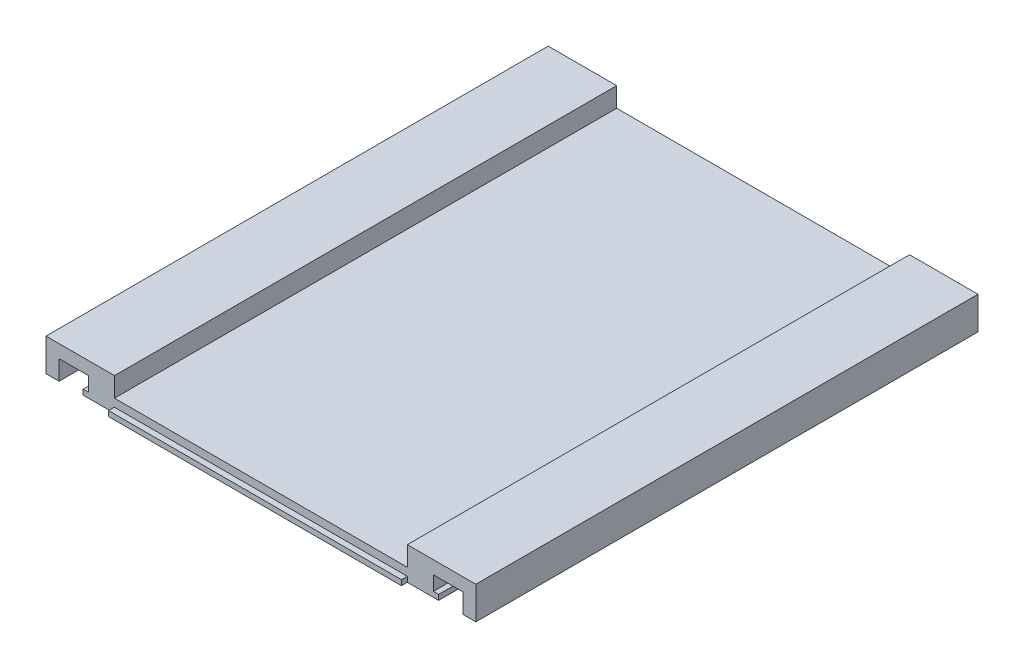
ISO-10303-21;
HEADER;
FILE_DESCRIPTION(('STEP AP214'),'2;1');
FILE_NAME('part.step','',(''),(''),'','','');
FILE_SCHEMA(('AUTOMOTIVE_DESIGN { 1 0 10303 214 1 1 1 1 }'));
ENDSEC;
DATA;
#1=APPLICATION_CONTEXT('core data for automotive mechanical design processes');
#2=APPLICATION_PROTOCOL_DEFINITION('international standard','automotive_design',2000,#1);
#3=PRODUCT_CONTEXT('',#1,'mechanical');
#4=PRODUCT('Part','Part','',(#3));
#5=PRODUCT_RELATED_PRODUCT_CATEGORY('part','',(#4));
#6=PRODUCT_DEFINITION_FORMATION('','',#4);
#7=PRODUCT_DEFINITION_CONTEXT('part definition',#1,'design');
#8=PRODUCT_DEFINITION('design','',#6,#7);
#9=PRODUCT_DEFINITION_SHAPE('','',#8);
#10=(LENGTH_UNIT() NAMED_UNIT(*) SI_UNIT(.MILLI.,.METRE.));
#11=(NAMED_UNIT(*) PLANE_ANGLE_UNIT() SI_UNIT($,.RADIAN.));
#12=(NAMED_UNIT(*) SI_UNIT($,.STERADIAN.) SOLID_ANGLE_UNIT());
#13=UNCERTAINTY_MEASURE_WITH_UNIT(LENGTH_MEASURE(1.E-05),#10,'distance_accuracy_value','');
#14=(GEOMETRIC_REPRESENTATION_CONTEXT(3) GLOBAL_UNCERTAINTY_ASSIGNED_CONTEXT((#13)) GLOBAL_UNIT_ASSIGNED_CONTEXT((#10,
#11,#12)) REPRESENTATION_CONTEXT('',''));
#15=CARTESIAN_POINT('',(0.,0.,0.));
#16=DIRECTION('',(0.,0.,1.));
#17=DIRECTION('',(1.,0.,0.));
#18=AXIS2_PLACEMENT_3D('',#15,#16,#17);
#19=CARTESIAN_POINT('',(0.,2.,0.));
#20=DIRECTION('',(0.,1.,0.));
#21=DIRECTION('',(0.,0.,1.));
#22=AXIS2_PLACEMENT_3D('',#19,#20,#21);
#23=PLANE('',#22);
#24=DIRECTION('',(-1.,0.,0.));
#25=VECTOR('',#24,1.);
#26=CARTESIAN_POINT('',(0.,2.,38.5));
#27=LINE('',#26,#25);
#28=CARTESIAN_POINT('',(22.45,2.,38.5));
#29=VERTEX_POINT('',#28);
#30=CARTESIAN_POINT('',(-22.45,2.,38.5));
#31=VERTEX_POINT('',#30);
#32=EDGE_CURVE('E68',#29,#31,#27,.T.);
#33=ORIENTED_EDGE('',*,*,#32,.F.);
#34=DIRECTION('',(0.,0.,-1.));
#35=VECTOR('',#34,1.);
#36=CARTESIAN_POINT('',(22.45,2.,50.129703349613));
#37=LINE('',#36,#35);
#38=CARTESIAN_POINT('',(22.45,2.,-38.5));
#39=VERTEX_POINT('',#38);
#40=EDGE_CURVE('E221',#29,#39,#37,.T.);
#41=ORIENTED_EDGE('',*,*,#40,.T.);
#42=DIRECTION('',(-1.,0.,0.));
#43=VECTOR('',#42,1.);
#44=CARTESIAN_POINT('',(0.,2.,-38.5));
#45=LINE('',#44,#43);
#46=CARTESIAN_POINT('',(-22.45,2.,-38.5));
#47=VERTEX_POINT('',#46);
#48=EDGE_CURVE('E209',#39,#47,#45,.T.);
#49=ORIENTED_EDGE('',*,*,#48,.T.);
#50=DIRECTION('',(0.,0.,-1.));
#51=VECTOR('',#50,1.);
#52=CARTESIAN_POINT('',(-22.45,2.,50.129703349613));
#53=LINE('',#52,#51);
#54=EDGE_CURVE('E64',#31,#47,#53,.T.);
#55=ORIENTED_EDGE('',*,*,#54,.F.);
#56=EDGE_LOOP('',(#33,#41,#49,#55));
#57=FACE_BOUND('',#56,.T.);
#58=ADVANCED_FACE('F47',(#57),#23,.T.);
#59=CARTESIAN_POINT('',(0.,0.,0.));
#60=DIRECTION('',(0.,1.,0.));
#61=DIRECTION('',(0.,0.,1.));
#62=AXIS2_PLACEMENT_3D('',#59,#60,#61);
#63=PLANE('',#62);
#64=DIRECTION('',(0.,0.,-1.));
#65=VECTOR('',#64,1.);
#66=CARTESIAN_POINT('',(-22.45,0.,38.5));
#67=LINE('',#66,#65);
#68=CARTESIAN_POINT('',(-22.45,0.,39.4));
#69=VERTEX_POINT('',#68);
#70=CARTESIAN_POINT('',(-22.45,0.,38.5));
#71=VERTEX_POINT('',#70);
#72=EDGE_CURVE('E354',#69,#71,#67,.T.);
#73=ORIENTED_EDGE('',*,*,#72,.T.);
#74=DIRECTION('',(-1.,0.,0.));
#75=VECTOR('',#74,1.);
#76=CARTESIAN_POINT('',(-27.25,0.,38.5));
#77=LINE('',#76,#75);
#78=CARTESIAN_POINT('',(-27.25,0.,38.5));
#79=VERTEX_POINT('',#78);
#80=EDGE_CURVE('E350',#71,#79,#77,.T.);
#81=ORIENTED_EDGE('',*,*,#80,.T.);
#82=DIRECTION('',(0.,0.,1.));
#83=VECTOR('',#82,1.);
#84=CARTESIAN_POINT('',(-27.25,0.,0.));
#85=LINE('',#84,#83);
#86=CARTESIAN_POINT('',(-27.25,0.,-38.5));
#87=VERTEX_POINT('',#86);
#88=EDGE_CURVE('E398',#87,#79,#85,.T.);
#89=ORIENTED_EDGE('',*,*,#88,.F.);
#90=DIRECTION('',(-1.,0.,0.));
#91=VECTOR('',#90,1.);
#92=CARTESIAN_POINT('',(0.,0.,-38.5));
#93=LINE('',#92,#91);
#94=CARTESIAN_POINT('',(27.25,0.,-38.5));
#95=VERTEX_POINT('',#94);
#96=EDGE_CURVE('E219',#95,#87,#93,.T.);
#97=ORIENTED_EDGE('',*,*,#96,.F.);
#98=DIRECTION('',(0.,0.,1.));
#99=VECTOR('',#98,1.);
#100=CARTESIAN_POINT('',(27.25,0.,0.));
#101=LINE('',#100,#99);
#102=CARTESIAN_POINT('',(27.25,0.,38.5));
#103=VERTEX_POINT('',#102);
#104=EDGE_CURVE('E407',#95,#103,#101,.T.);
#105=ORIENTED_EDGE('',*,*,#104,.T.);
#106=DIRECTION('',(-1.,0.,0.));
#107=VECTOR('',#106,1.);
#108=CARTESIAN_POINT('',(27.25,0.,38.5));
#109=LINE('',#108,#107);
#110=CARTESIAN_POINT('',(22.45,0.,38.5));
#111=VERTEX_POINT('',#110);
#112=EDGE_CURVE('E358',#103,#111,#109,.T.);
#113=ORIENTED_EDGE('',*,*,#112,.T.);
#114=DIRECTION('',(0.,0.,1.));
#115=VECTOR('',#114,1.);
#116=CARTESIAN_POINT('',(22.45,0.,38.5));
#117=LINE('',#116,#115);
#118=CARTESIAN_POINT('',(22.45,0.,39.4));
#119=VERTEX_POINT('',#118);
#120=EDGE_CURVE('E382',#111,#119,#117,.T.);
#121=ORIENTED_EDGE('',*,*,#120,.T.);
#122=DIRECTION('',(1.,0.,0.));
#123=VECTOR('',#122,1.);
#124=CARTESIAN_POINT('',(-27.25,0.,39.4));
#125=LINE('',#124,#123);
#126=EDGE_CURVE('E371',#69,#119,#125,.T.);
#127=ORIENTED_EDGE('',*,*,#126,.F.);
#128=EDGE_LOOP('',(#73,#81,#89,#97,#105,#113,#121,#127));
#129=FACE_BOUND('',#128,.T.);
#130=ADVANCED_FACE('F474',(#129),#63,.F.);
#131=CARTESIAN_POINT('',(-27.25,0.8,0.));
#132=DIRECTION('',(1.,0.,0.));
#133=DIRECTION('',(0.,0.,-1.));
#134=AXIS2_PLACEMENT_3D('',#131,#132,#133);
#135=PLANE('',#134);
#136=DIRECTION('',(0.,-1.,0.));
#137=VECTOR('',#136,1.);
#138=CARTESIAN_POINT('',(-27.25,0.8,38.5));
#139=LINE('',#138,#137);
#140=CARTESIAN_POINT('',(-27.25,0.8,38.5));
#141=VERTEX_POINT('',#140);
#142=EDGE_CURVE('E353',#141,#79,#139,.T.);
#143=ORIENTED_EDGE('',*,*,#142,.F.);
#144=DIRECTION('',(0.,0.,1.));
#145=VECTOR('',#144,1.);
#146=CARTESIAN_POINT('',(-27.25,0.8,0.));
#147=LINE('',#146,#145);
#148=CARTESIAN_POINT('',(-27.25,0.8,-38.5));
#149=VERTEX_POINT('',#148);
#150=EDGE_CURVE('E427',#149,#141,#147,.T.);
#151=ORIENTED_EDGE('',*,*,#150,.F.);
#152=DIRECTION('',(0.,-1.,0.));
#153=VECTOR('',#152,1.);
#154=CARTESIAN_POINT('',(-27.25,0.8,-38.5));
#155=LINE('',#154,#153);
#156=EDGE_CURVE('E419',#149,#87,#155,.T.);
#157=ORIENTED_EDGE('',*,*,#156,.T.);
#158=ORIENTED_EDGE('',*,*,#88,.T.);
#159=EDGE_LOOP('',(#143,#151,#157,#158));
#160=FACE_BOUND('',#159,.T.);
#161=ADVANCED_FACE('F478',(#160),#135,.F.);
#162=CARTESIAN_POINT('',(27.25,0.8,0.));
#163=DIRECTION('',(1.,0.,0.));
#164=DIRECTION('',(0.,0.,-1.));
#165=AXIS2_PLACEMENT_3D('',#162,#163,#164);
#166=PLANE('',#165);
#167=DIRECTION('',(0.,0.,1.));
#168=VECTOR('',#167,1.);
#169=CARTESIAN_POINT('',(27.25,0.8,0.));
#170=LINE('',#169,#168);
#171=CARTESIAN_POINT('',(27.25,0.8,-38.5));
#172=VERTEX_POINT('',#171);
#173=CARTESIAN_POINT('',(27.25,0.8,38.5));
#174=VERTEX_POINT('',#173);
#175=EDGE_CURVE('E411',#172,#174,#170,.T.);
#176=ORIENTED_EDGE('',*,*,#175,.T.);
#177=DIRECTION('',(0.,-1.,0.));
#178=VECTOR('',#177,1.);
#179=CARTESIAN_POINT('',(27.25,0.8,38.5));
#180=LINE('',#179,#178);
#181=EDGE_CURVE('E242',#174,#103,#180,.T.);
#182=ORIENTED_EDGE('',*,*,#181,.T.);
#183=ORIENTED_EDGE('',*,*,#104,.F.);
#184=DIRECTION('',(0.,-1.,0.));
#185=VECTOR('',#184,1.);
#186=CARTESIAN_POINT('',(27.25,0.8,-38.5));
#187=LINE('',#186,#185);
#188=EDGE_CURVE('E415',#172,#95,#187,.T.);
#189=ORIENTED_EDGE('',*,*,#188,.F.);
#190=EDGE_LOOP('',(#176,#182,#183,#189));
#191=FACE_BOUND('',#190,.T.);
#192=ADVANCED_FACE('F469',(#191),#166,.T.);
#193=CARTESIAN_POINT('',(0.,0.8,0.));
#194=DIRECTION('',(0.,1.,0.));
#195=DIRECTION('',(0.,0.,1.));
#196=AXIS2_PLACEMENT_3D('',#193,#194,#195);
#197=PLANE('',#196);
#198=DIRECTION('',(-1.,0.,0.));
#199=VECTOR('',#198,1.);
#200=CARTESIAN_POINT('',(27.25,0.8,38.5));
#201=LINE('',#200,#199);
#202=CARTESIAN_POINT('',(22.45,0.8,38.5));
#203=VERTEX_POINT('',#202);
#204=CARTESIAN_POINT('',(-22.45,0.8,38.5));
#205=VERTEX_POINT('',#204);
#206=EDGE_CURVE('E11',#203,#205,#201,.T.);
#207=ORIENTED_EDGE('',*,*,#206,.T.);
#208=DIRECTION('',(0.,0.,-1.));
#209=VECTOR('',#208,1.);
#210=CARTESIAN_POINT('',(-22.45,0.8,38.5));
#211=LINE('',#210,#209);
#212=CARTESIAN_POINT('',(-22.45,0.8,39.4));
#213=VERTEX_POINT('',#212);
#214=EDGE_CURVE('E346',#213,#205,#211,.T.);
#215=ORIENTED_EDGE('',*,*,#214,.F.);
#216=DIRECTION('',(1.,0.,0.));
#217=VECTOR('',#216,1.);
#218=CARTESIAN_POINT('',(-27.25,0.8,39.4));
#219=LINE('',#218,#217);
#220=CARTESIAN_POINT('',(22.45,0.8,39.4));
#221=VERTEX_POINT('',#220);
#222=EDGE_CURVE('E394',#213,#221,#219,.T.);
#223=ORIENTED_EDGE('',*,*,#222,.T.);
#224=DIRECTION('',(0.,0.,1.));
#225=VECTOR('',#224,1.);
#226=CARTESIAN_POINT('',(22.45,0.8,38.5));
#227=LINE('',#226,#225);
#228=EDGE_CURVE('E381',#203,#221,#227,.T.);
#229=ORIENTED_EDGE('',*,*,#228,.F.);
#230=EDGE_LOOP('',(#207,#215,#223,#229));
#231=FACE_BOUND('',#230,.T.);
#232=ADVANCED_FACE('F548',(#231),#197,.T.);
#233=ORIENTED_EDGE('',*,*,#150,.T.);
#234=DIRECTION('',(-1.,0.,0.));
#235=VECTOR('',#234,1.);
#236=CARTESIAN_POINT('',(-27.25,0.8,38.5));
#237=LINE('',#236,#235);
#238=CARTESIAN_POINT('',(-26.45,0.8,38.5));
#239=VERTEX_POINT('',#238);
#240=EDGE_CURVE('E349',#239,#141,#237,.T.);
#241=ORIENTED_EDGE('',*,*,#240,.F.);
#242=DIRECTION('',(0.,0.,1.));
#243=VECTOR('',#242,1.);
#244=CARTESIAN_POINT('',(-26.45,0.8,0.));
#245=LINE('',#244,#243);
#246=CARTESIAN_POINT('',(-26.45,0.8,-38.5));
#247=VERTEX_POINT('',#246);
#248=EDGE_CURVE('E431',#247,#239,#245,.T.);
#249=ORIENTED_EDGE('',*,*,#248,.F.);
#250=DIRECTION('',(-1.,0.,0.));
#251=VECTOR('',#250,1.);
#252=CARTESIAN_POINT('',(0.,0.8,-38.5));
#253=LINE('',#252,#251);
#254=EDGE_CURVE('E423',#247,#149,#253,.T.);
#255=ORIENTED_EDGE('',*,*,#254,.T.);
#256=EDGE_LOOP('',(#233,#241,#249,#255));
#257=FACE_BOUND('',#256,.T.);
#258=ADVANCED_FACE('F481',(#257),#197,.T.);
#259=DIRECTION('',(0.,0.,1.));
#260=VECTOR('',#259,1.);
#261=CARTESIAN_POINT('',(26.45,0.8,0.));
#262=LINE('',#261,#260);
#263=CARTESIAN_POINT('',(26.45,0.8,-38.5));
#264=VERTEX_POINT('',#263);
#265=CARTESIAN_POINT('',(26.45,0.8,38.5));
#266=VERTEX_POINT('',#265);
#267=EDGE_CURVE('E406',#264,#266,#262,.T.);
#268=ORIENTED_EDGE('',*,*,#267,.T.);
#269=DIRECTION('',(-1.,0.,0.));
#270=VECTOR('',#269,1.);
#271=CARTESIAN_POINT('',(27.25,0.8,38.5));
#272=LINE('',#271,#270);
#273=EDGE_CURVE('E386',#174,#266,#272,.T.);
#274=ORIENTED_EDGE('',*,*,#273,.F.);
#275=ORIENTED_EDGE('',*,*,#175,.F.);
#276=DIRECTION('',(-1.,0.,0.));
#277=VECTOR('',#276,1.);
#278=CARTESIAN_POINT('',(0.,0.8,-38.5));
#279=LINE('',#278,#277);
#280=EDGE_CURVE('E402',#172,#264,#279,.T.);
#281=ORIENTED_EDGE('',*,*,#280,.T.);
#282=EDGE_LOOP('',(#268,#274,#275,#281));
#283=FACE_BOUND('',#282,.T.);
#284=ADVANCED_FACE('F466',(#283),#197,.T.);
#285=CARTESIAN_POINT('',(-27.25,0.8,39.4));
#286=DIRECTION('',(0.,0.,-1.));
#287=DIRECTION('',(-1.,0.,0.));
#288=AXIS2_PLACEMENT_3D('',#285,#286,#287);
#289=PLANE('',#288);
#290=DIRECTION('',(0.,-1.,0.));
#291=VECTOR('',#290,1.);
#292=CARTESIAN_POINT('',(-22.45,0.8,39.4));
#293=LINE('',#292,#291);
#294=EDGE_CURVE('E367',#213,#69,#293,.T.);
#295=ORIENTED_EDGE('',*,*,#294,.T.);
#296=ORIENTED_EDGE('',*,*,#126,.T.);
#297=DIRECTION('',(0.,-1.,0.));
#298=VECTOR('',#297,1.);
#299=CARTESIAN_POINT('',(22.45,0.8,39.4));
#300=LINE('',#299,#298);
#301=EDGE_CURVE('E378',#221,#119,#300,.T.);
#302=ORIENTED_EDGE('',*,*,#301,.F.);
#303=ORIENTED_EDGE('',*,*,#222,.F.);
#304=EDGE_LOOP('',(#295,#296,#302,#303));
#305=FACE_BOUND('',#304,.T.);
#306=ADVANCED_FACE('F541',(#305),#289,.F.);
#307=CARTESIAN_POINT('',(26.45,2.,0.));
#308=DIRECTION('',(1.,0.,0.));
#309=DIRECTION('',(0.,0.,-1.));
#310=AXIS2_PLACEMENT_3D('',#307,#308,#309);
#311=PLANE('',#310);
#312=ORIENTED_EDGE('',*,*,#267,.F.);
#313=DIRECTION('',(0.,-1.,0.));
#314=VECTOR('',#313,1.);
#315=CARTESIAN_POINT('',(26.45,2.,-38.5));
#316=LINE('',#315,#314);
#317=CARTESIAN_POINT('',(26.45,3.,-38.5));
#318=VERTEX_POINT('',#317);
#319=EDGE_CURVE('E51',#318,#264,#316,.T.);
#320=ORIENTED_EDGE('',*,*,#319,.F.);
#321=DIRECTION('',(0.,0.,-1.));
#322=VECTOR('',#321,1.);
#323=CARTESIAN_POINT('',(26.45,3.,50.129703349613));
#324=LINE('',#323,#322);
#325=CARTESIAN_POINT('',(26.45,3.,38.5));
#326=VERTEX_POINT('',#325);
#327=EDGE_CURVE('E226',#326,#318,#324,.T.);
#328=ORIENTED_EDGE('',*,*,#327,.F.);
#329=DIRECTION('',(0.,-1.,0.));
#330=VECTOR('',#329,1.);
#331=CARTESIAN_POINT('',(26.45,2.,38.5));
#332=LINE('',#331,#330);
#333=EDGE_CURVE('E443',#326,#266,#332,.T.);
#334=ORIENTED_EDGE('',*,*,#333,.T.);
#335=EDGE_LOOP('',(#312,#320,#328,#334));
#336=FACE_BOUND('',#335,.T.);
#337=ADVANCED_FACE('F49',(#336),#311,.T.);
#338=CARTESIAN_POINT('',(0.,2.,-38.5));
#339=DIRECTION('',(0.,0.,1.));
#340=DIRECTION('',(1.,0.,0.));
#341=AXIS2_PLACEMENT_3D('',#338,#339,#340);
#342=PLANE('',#341);
#343=ORIENTED_EDGE('',*,*,#96,.T.);
#344=ORIENTED_EDGE('',*,*,#156,.F.);
#345=ORIENTED_EDGE('',*,*,#254,.F.);
#346=DIRECTION('',(0.,-1.,0.));
#347=VECTOR('',#346,1.);
#348=CARTESIAN_POINT('',(-26.45,2.,-38.5));
#349=LINE('',#348,#347);
#350=CARTESIAN_POINT('',(-26.45,3.,-38.5));
#351=VERTEX_POINT('',#350);
#352=EDGE_CURVE('E452',#351,#247,#349,.T.);
#353=ORIENTED_EDGE('',*,*,#352,.F.);
#354=DIRECTION('',(-1.,0.,0.));
#355=VECTOR('',#354,1.);
#356=CARTESIAN_POINT('',(-30.95,2.99999999999999,-38.5));
#357=LINE('',#356,#355);
#358=CARTESIAN_POINT('',(-30.95,2.99999999999999,-38.5));
#359=VERTEX_POINT('',#358);
#360=EDGE_CURVE('E341',#351,#359,#357,.T.);
#361=ORIENTED_EDGE('',*,*,#360,.T.);
#362=DIRECTION('',(0.,-1.,0.));
#363=VECTOR('',#362,1.);
#364=CARTESIAN_POINT('',(-30.95,0.,-38.5));
#365=LINE('',#364,#363);
#366=CARTESIAN_POINT('',(-30.95,0.,-38.5));
#367=VERTEX_POINT('',#366);
#368=EDGE_CURVE('E282',#359,#367,#365,.T.);
#369=ORIENTED_EDGE('',*,*,#368,.T.);
#370=DIRECTION('',(-1.,0.,0.));
#371=VECTOR('',#370,1.);
#372=CARTESIAN_POINT('',(-32.95,0.,-38.5));
#373=LINE('',#372,#371);
#374=CARTESIAN_POINT('',(-32.95,0.,-38.5));
#375=VERTEX_POINT('',#374);
#376=EDGE_CURVE('E328',#367,#375,#373,.T.);
#377=ORIENTED_EDGE('',*,*,#376,.T.);
#378=DIRECTION('',(0.,1.,0.));
#379=VECTOR('',#378,1.);
#380=CARTESIAN_POINT('',(-32.95,4.99999999999999,-38.5));
#381=LINE('',#380,#379);
#382=CARTESIAN_POINT('',(-32.95,4.99999999999999,-38.5));
#383=VERTEX_POINT('',#382);
#384=EDGE_CURVE('E332',#375,#383,#381,.T.);
#385=ORIENTED_EDGE('',*,*,#384,.T.);
#386=DIRECTION('',(1.,0.,0.));
#387=VECTOR('',#386,1.);
#388=CARTESIAN_POINT('',(-22.45,4.99999999999999,-38.5));
#389=LINE('',#388,#387);
#390=CARTESIAN_POINT('',(-22.45,4.99999999999999,-38.5));
#391=VERTEX_POINT('',#390);
#392=EDGE_CURVE('E336',#383,#391,#389,.T.);
#393=ORIENTED_EDGE('',*,*,#392,.T.);
#394=DIRECTION('',(0.,-1.,0.));
#395=VECTOR('',#394,1.);
#396=CARTESIAN_POINT('',(-22.45,2.99999999999999,-38.5));
#397=LINE('',#396,#395);
#398=EDGE_CURVE('E217',#391,#47,#397,.T.);
#399=ORIENTED_EDGE('',*,*,#398,.T.);
#400=ORIENTED_EDGE('',*,*,#48,.F.);
#401=DIRECTION('',(0.,1.,0.));
#402=VECTOR('',#401,1.);
#403=CARTESIAN_POINT('',(22.45,3.,-38.5));
#404=LINE('',#403,#402);
#405=CARTESIAN_POINT('',(22.45,5.,-38.5));
#406=VERTEX_POINT('',#405);
#407=EDGE_CURVE('E213',#39,#406,#404,.T.);
#408=ORIENTED_EDGE('',*,*,#407,.T.);
#409=DIRECTION('',(1.,0.,0.));
#410=VECTOR('',#409,1.);
#411=CARTESIAN_POINT('',(22.45,5.,-38.5));
#412=LINE('',#411,#410);
#413=CARTESIAN_POINT('',(32.95,5.,-38.5));
#414=VERTEX_POINT('',#413);
#415=EDGE_CURVE('E231',#406,#414,#412,.T.);
#416=ORIENTED_EDGE('',*,*,#415,.T.);
#417=DIRECTION('',(0.,-1.,0.));
#418=VECTOR('',#417,1.);
#419=CARTESIAN_POINT('',(32.95,5.,-38.5));
#420=LINE('',#419,#418);
#421=CARTESIAN_POINT('',(32.95,0.,-38.5));
#422=VERTEX_POINT('',#421);
#423=EDGE_CURVE('E234',#414,#422,#420,.T.);
#424=ORIENTED_EDGE('',*,*,#423,.T.);
#425=DIRECTION('',(-1.,0.,0.));
#426=VECTOR('',#425,1.);
#427=CARTESIAN_POINT('',(32.95,0.,-38.5));
#428=LINE('',#427,#426);
#429=CARTESIAN_POINT('',(30.95,0.,-38.5));
#430=VERTEX_POINT('',#429);
#431=EDGE_CURVE('E521',#422,#430,#428,.T.);
#432=ORIENTED_EDGE('',*,*,#431,.T.);
#433=DIRECTION('',(0.,1.,0.));
#434=VECTOR('',#433,1.);
#435=CARTESIAN_POINT('',(30.95,0.,-38.5));
#436=LINE('',#435,#434);
#437=CARTESIAN_POINT('',(30.95,3.,-38.5));
#438=VERTEX_POINT('',#437);
#439=EDGE_CURVE('E523',#430,#438,#436,.T.);
#440=ORIENTED_EDGE('',*,*,#439,.T.);
#441=DIRECTION('',(-1.,0.,0.));
#442=VECTOR('',#441,1.);
#443=CARTESIAN_POINT('',(30.95,3.,-38.5));
#444=LINE('',#443,#442);
#445=EDGE_CURVE('E345',#438,#318,#444,.T.);
#446=ORIENTED_EDGE('',*,*,#445,.T.);
#447=ORIENTED_EDGE('',*,*,#319,.T.);
#448=ORIENTED_EDGE('',*,*,#280,.F.);
#449=ORIENTED_EDGE('',*,*,#188,.T.);
#450=EDGE_LOOP('',(#343,#344,#345,#353,#361,#369,#377,#385,#393,#399,#400,#408,#416,#424,#432,
#440,#446,#447,#448,#449));
#451=FACE_BOUND('',#450,.T.);
#452=ADVANCED_FACE('F210',(#451),#342,.F.);
#453=CARTESIAN_POINT('',(-26.45,2.,0.));
#454=DIRECTION('',(1.,0.,0.));
#455=DIRECTION('',(0.,0.,-1.));
#456=AXIS2_PLACEMENT_3D('',#453,#454,#455);
#457=PLANE('',#456);
#458=ORIENTED_EDGE('',*,*,#352,.T.);
#459=ORIENTED_EDGE('',*,*,#248,.T.);
#460=DIRECTION('',(0.,-1.,0.));
#461=VECTOR('',#460,1.);
#462=CARTESIAN_POINT('',(-26.45,2.,38.5));
#463=LINE('',#462,#461);
#464=CARTESIAN_POINT('',(-26.45,3.,38.5));
#465=VERTEX_POINT('',#464);
#466=EDGE_CURVE('E449',#465,#239,#463,.T.);
#467=ORIENTED_EDGE('',*,*,#466,.F.);
#468=DIRECTION('',(0.,0.,-1.));
#469=VECTOR('',#468,1.);
#470=CARTESIAN_POINT('',(-26.45,3.,50.129703349613));
#471=LINE('',#470,#469);
#472=EDGE_CURVE('E293',#465,#351,#471,.T.);
#473=ORIENTED_EDGE('',*,*,#472,.T.);
#474=EDGE_LOOP('',(#458,#459,#467,#473));
#475=FACE_BOUND('',#474,.T.);
#476=ADVANCED_FACE('F485',(#475),#457,.F.);
#477=CARTESIAN_POINT('',(0.,2.,38.5));
#478=DIRECTION('',(0.,0.,1.));
#479=DIRECTION('',(1.,0.,0.));
#480=AXIS2_PLACEMENT_3D('',#477,#478,#479);
#481=PLANE('',#480);
#482=ORIENTED_EDGE('',*,*,#206,.F.);
#483=DIRECTION('',(0.,-1.,0.));
#484=VECTOR('',#483,1.);
#485=CARTESIAN_POINT('',(22.45,0.8,38.5));
#486=LINE('',#485,#484);
#487=EDGE_CURVE('E375',#203,#111,#486,.T.);
#488=ORIENTED_EDGE('',*,*,#487,.T.);
#489=ORIENTED_EDGE('',*,*,#112,.F.);
#490=ORIENTED_EDGE('',*,*,#181,.F.);
#491=ORIENTED_EDGE('',*,*,#273,.T.);
#492=ORIENTED_EDGE('',*,*,#333,.F.);
#493=DIRECTION('',(1.,0.,0.));
#494=VECTOR('',#493,1.);
#495=CARTESIAN_POINT('',(30.95,3.,38.5));
#496=LINE('',#495,#494);
#497=CARTESIAN_POINT('',(30.95,3.,38.5));
#498=VERTEX_POINT('',#497);
#499=EDGE_CURVE('E255',#326,#498,#496,.T.);
#500=ORIENTED_EDGE('',*,*,#499,.T.);
#501=DIRECTION('',(0.,-1.,0.));
#502=VECTOR('',#501,1.);
#503=CARTESIAN_POINT('',(30.95,0.,38.5));
#504=LINE('',#503,#502);
#505=CARTESIAN_POINT('',(30.95,0.,38.5));
#506=VERTEX_POINT('',#505);
#507=EDGE_CURVE('E251',#498,#506,#504,.T.);
#508=ORIENTED_EDGE('',*,*,#507,.T.);
#509=DIRECTION('',(1.,0.,0.));
#510=VECTOR('',#509,1.);
#511=CARTESIAN_POINT('',(32.95,0.,38.5));
#512=LINE('',#511,#510);
#513=CARTESIAN_POINT('',(32.95,0.,38.5));
#514=VERTEX_POINT('',#513);
#515=EDGE_CURVE('E247',#506,#514,#512,.T.);
#516=ORIENTED_EDGE('',*,*,#515,.T.);
#517=DIRECTION('',(0.,1.,0.));
#518=VECTOR('',#517,1.);
#519=CARTESIAN_POINT('',(32.95,5.,38.5));
#520=LINE('',#519,#518);
#521=CARTESIAN_POINT('',(32.95,5.,38.5));
#522=VERTEX_POINT('',#521);
#523=EDGE_CURVE('E243',#514,#522,#520,.T.);
#524=ORIENTED_EDGE('',*,*,#523,.T.);
#525=DIRECTION('',(-1.,0.,0.));
#526=VECTOR('',#525,1.);
#527=CARTESIAN_POINT('',(22.45,5.,38.5));
#528=LINE('',#527,#526);
#529=CARTESIAN_POINT('',(22.45,5.,38.5));
#530=VERTEX_POINT('',#529);
#531=EDGE_CURVE('E238',#522,#530,#528,.T.);
#532=ORIENTED_EDGE('',*,*,#531,.T.);
#533=DIRECTION('',(0.,-1.,0.));
#534=VECTOR('',#533,1.);
#535=CARTESIAN_POINT('',(22.45,3.,38.5));
#536=LINE('',#535,#534);
#537=EDGE_CURVE('E259',#530,#29,#536,.T.);
#538=ORIENTED_EDGE('',*,*,#537,.T.);
#539=ORIENTED_EDGE('',*,*,#32,.T.);
#540=DIRECTION('',(0.,1.,0.));
#541=VECTOR('',#540,1.);
#542=CARTESIAN_POINT('',(-22.45,2.99999999999999,38.5));
#543=LINE('',#542,#541);
#544=CARTESIAN_POINT('',(-22.45,4.99999999999999,38.5));
#545=VERTEX_POINT('',#544);
#546=EDGE_CURVE('E317',#31,#545,#543,.T.);
#547=ORIENTED_EDGE('',*,*,#546,.T.);
#548=DIRECTION('',(-1.,0.,0.));
#549=VECTOR('',#548,1.);
#550=CARTESIAN_POINT('',(-22.45,4.99999999999999,38.5));
#551=LINE('',#550,#549);
#552=CARTESIAN_POINT('',(-32.95,4.99999999999999,38.5));
#553=VERTEX_POINT('',#552);
#554=EDGE_CURVE('E321',#545,#553,#551,.T.);
#555=ORIENTED_EDGE('',*,*,#554,.T.);
#556=DIRECTION('',(0.,-1.,0.));
#557=VECTOR('',#556,1.);
#558=CARTESIAN_POINT('',(-32.95,4.99999999999999,38.5));
#559=LINE('',#558,#557);
#560=CARTESIAN_POINT('',(-32.95,0.,38.5));
#561=VERTEX_POINT('',#560);
#562=EDGE_CURVE('E288',#553,#561,#559,.T.);
#563=ORIENTED_EDGE('',*,*,#562,.T.);
#564=DIRECTION('',(1.,0.,0.));
#565=VECTOR('',#564,1.);
#566=CARTESIAN_POINT('',(-32.95,0.,38.5));
#567=LINE('',#566,#565);
#568=CARTESIAN_POINT('',(-30.95,0.,38.5));
#569=VERTEX_POINT('',#568);
#570=EDGE_CURVE('E305',#561,#569,#567,.T.);
#571=ORIENTED_EDGE('',*,*,#570,.T.);
#572=DIRECTION('',(0.,1.,0.));
#573=VECTOR('',#572,1.);
#574=CARTESIAN_POINT('',(-30.95,0.,38.5));
#575=LINE('',#574,#573);
#576=CARTESIAN_POINT('',(-30.95,2.99999999999999,38.5));
#577=VERTEX_POINT('',#576);
#578=EDGE_CURVE('E309',#569,#577,#575,.T.);
#579=ORIENTED_EDGE('',*,*,#578,.T.);
#580=DIRECTION('',(1.,0.,0.));
#581=VECTOR('',#580,1.);
#582=CARTESIAN_POINT('',(-30.95,2.99999999999999,38.5));
#583=LINE('',#582,#581);
#584=EDGE_CURVE('E313',#577,#465,#583,.T.);
#585=ORIENTED_EDGE('',*,*,#584,.T.);
#586=ORIENTED_EDGE('',*,*,#466,.T.);
#587=ORIENTED_EDGE('',*,*,#240,.T.);
#588=ORIENTED_EDGE('',*,*,#142,.T.);
#589=ORIENTED_EDGE('',*,*,#80,.F.);
#590=DIRECTION('',(0.,-1.,0.));
#591=VECTOR('',#590,1.);
#592=CARTESIAN_POINT('',(-22.45,0.8,38.5));
#593=LINE('',#592,#591);
#594=EDGE_CURVE('E364',#205,#71,#593,.T.);
#595=ORIENTED_EDGE('',*,*,#594,.F.);
#596=EDGE_LOOP('',(#482,#488,#489,#490,#491,#492,#500,#508,#516,#524,#532,#538,#539,#547,#555,
#563,#571,#579,#585,#586,#587,#588,#589,#595));
#597=FACE_BOUND('',#596,.T.);
#598=ADVANCED_FACE('F494',(#597),#481,.T.);
#599=CARTESIAN_POINT('',(22.45,0.8,38.5));
#600=DIRECTION('',(1.,0.,0.));
#601=DIRECTION('',(0.,0.,-1.));
#602=AXIS2_PLACEMENT_3D('',#599,#600,#601);
#603=PLANE('',#602);
#604=ORIENTED_EDGE('',*,*,#120,.F.);
#605=ORIENTED_EDGE('',*,*,#487,.F.);
#606=ORIENTED_EDGE('',*,*,#228,.T.);
#607=ORIENTED_EDGE('',*,*,#301,.T.);
#608=EDGE_LOOP('',(#604,#605,#606,#607));
#609=FACE_BOUND('',#608,.T.);
#610=ADVANCED_FACE('F550',(#609),#603,.T.);
#611=CARTESIAN_POINT('',(-22.45,0.8,38.5));
#612=DIRECTION('',(-1.,0.,0.));
#613=DIRECTION('',(0.,0.,1.));
#614=AXIS2_PLACEMENT_3D('',#611,#612,#613);
#615=PLANE('',#614);
#616=ORIENTED_EDGE('',*,*,#72,.F.);
#617=ORIENTED_EDGE('',*,*,#294,.F.);
#618=ORIENTED_EDGE('',*,*,#214,.T.);
#619=ORIENTED_EDGE('',*,*,#594,.T.);
#620=EDGE_LOOP('',(#616,#617,#618,#619));
#621=FACE_BOUND('',#620,.T.);
#622=ADVANCED_FACE('F545',(#621),#615,.T.);
#623=CARTESIAN_POINT('',(-32.95,0.,50.129703349613));
#624=DIRECTION('',(0.,1.,0.));
#625=DIRECTION('',(-1.,0.,0.));
#626=AXIS2_PLACEMENT_3D('',#623,#624,#625);
#627=PLANE('',#626);
#628=ORIENTED_EDGE('',*,*,#570,.F.);
#629=DIRECTION('',(0.,0.,-1.));
#630=VECTOR('',#629,1.);
#631=CARTESIAN_POINT('',(-32.95,0.,50.129703349613));
#632=LINE('',#631,#630);
#633=EDGE_CURVE('E279',#561,#375,#632,.T.);
#634=ORIENTED_EDGE('',*,*,#633,.T.);
#635=ORIENTED_EDGE('',*,*,#376,.F.);
#636=DIRECTION('',(0.,0.,-1.));
#637=VECTOR('',#636,1.);
#638=CARTESIAN_POINT('',(-30.95,0.,50.129703349613));
#639=LINE('',#638,#637);
#640=EDGE_CURVE('E283',#569,#367,#639,.T.);
#641=ORIENTED_EDGE('',*,*,#640,.F.);
#642=EDGE_LOOP('',(#628,#634,#635,#641));
#643=FACE_BOUND('',#642,.T.);
#644=ADVANCED_FACE('F498',(#643),#627,.F.);
#645=CARTESIAN_POINT('',(-30.95,0.,50.129703349613));
#646=DIRECTION('',(-1.,0.,0.));
#647=DIRECTION('',(0.,0.,1.));
#648=AXIS2_PLACEMENT_3D('',#645,#646,#647);
#649=PLANE('',#648);
#650=ORIENTED_EDGE('',*,*,#578,.F.);
#651=ORIENTED_EDGE('',*,*,#640,.T.);
#652=ORIENTED_EDGE('',*,*,#368,.F.);
#653=DIRECTION('',(0.,0.,-1.));
#654=VECTOR('',#653,1.);
#655=CARTESIAN_POINT('',(-30.95,2.99999999999999,50.129703349613));
#656=LINE('',#655,#654);
#657=EDGE_CURVE('E297',#577,#359,#656,.T.);
#658=ORIENTED_EDGE('',*,*,#657,.F.);
#659=EDGE_LOOP('',(#650,#651,#652,#658));
#660=FACE_BOUND('',#659,.T.);
#661=ADVANCED_FACE('F490',(#660),#649,.F.);
#662=CARTESIAN_POINT('',(-30.95,2.99999999999999,50.129703349613));
#663=DIRECTION('',(0.,1.,0.));
#664=DIRECTION('',(-1.,0.,0.));
#665=AXIS2_PLACEMENT_3D('',#662,#663,#664);
#666=PLANE('',#665);
#667=ORIENTED_EDGE('',*,*,#584,.F.);
#668=ORIENTED_EDGE('',*,*,#657,.T.);
#669=ORIENTED_EDGE('',*,*,#360,.F.);
#670=ORIENTED_EDGE('',*,*,#472,.F.);
#671=EDGE_LOOP('',(#667,#668,#669,#670));
#672=FACE_BOUND('',#671,.T.);
#673=ADVANCED_FACE('F487',(#672),#666,.F.);
#674=CARTESIAN_POINT('',(-22.45,2.99999999999999,50.129703349613));
#675=DIRECTION('',(-1.,0.,0.));
#676=DIRECTION('',(0.,0.,1.));
#677=AXIS2_PLACEMENT_3D('',#674,#675,#676);
#678=PLANE('',#677);
#679=ORIENTED_EDGE('',*,*,#546,.F.);
#680=ORIENTED_EDGE('',*,*,#54,.T.);
#681=ORIENTED_EDGE('',*,*,#398,.F.);
#682=DIRECTION('',(0.,0.,-1.));
#683=VECTOR('',#682,1.);
#684=CARTESIAN_POINT('',(-22.45,4.99999999999999,50.129703349613));
#685=LINE('',#684,#683);
#686=EDGE_CURVE('E287',#545,#391,#685,.T.);
#687=ORIENTED_EDGE('',*,*,#686,.F.);
#688=EDGE_LOOP('',(#679,#680,#681,#687));
#689=FACE_BOUND('',#688,.T.);
#690=ADVANCED_FACE('F509',(#689),#678,.F.);
#691=CARTESIAN_POINT('',(-22.45,4.99999999999999,50.129703349613));
#692=DIRECTION('',(0.,-1.,0.));
#693=DIRECTION('',(1.,0.,0.));
#694=AXIS2_PLACEMENT_3D('',#691,#692,#693);
#695=PLANE('',#694);
#696=ORIENTED_EDGE('',*,*,#554,.F.);
#697=ORIENTED_EDGE('',*,*,#686,.T.);
#698=ORIENTED_EDGE('',*,*,#392,.F.);
#699=DIRECTION('',(0.,0.,-1.));
#700=VECTOR('',#699,1.);
#701=CARTESIAN_POINT('',(-32.95,4.99999999999999,50.129703349613));
#702=LINE('',#701,#700);
#703=EDGE_CURVE('E284',#553,#383,#702,.T.);
#704=ORIENTED_EDGE('',*,*,#703,.F.);
#705=EDGE_LOOP('',(#696,#697,#698,#704));
#706=FACE_BOUND('',#705,.T.);
#707=ADVANCED_FACE('F505',(#706),#695,.F.);
#708=CARTESIAN_POINT('',(-32.95,4.99999999999999,50.129703349613));
#709=DIRECTION('',(1.,0.,0.));
#710=DIRECTION('',(0.,0.,-1.));
#711=AXIS2_PLACEMENT_3D('',#708,#709,#710);
#712=PLANE('',#711);
#713=ORIENTED_EDGE('',*,*,#562,.F.);
#714=ORIENTED_EDGE('',*,*,#703,.T.);
#715=ORIENTED_EDGE('',*,*,#384,.F.);
#716=ORIENTED_EDGE('',*,*,#633,.F.);
#717=EDGE_LOOP('',(#713,#714,#715,#716));
#718=FACE_BOUND('',#717,.T.);
#719=ADVANCED_FACE('F503',(#718),#712,.F.);
#720=CARTESIAN_POINT('',(30.95,3.,50.129703349613));
#721=DIRECTION('',(0.,1.,0.));
#722=DIRECTION('',(-1.,0.,0.));
#723=AXIS2_PLACEMENT_3D('',#720,#721,#722);
#724=PLANE('',#723);
#725=ORIENTED_EDGE('',*,*,#499,.F.);
#726=ORIENTED_EDGE('',*,*,#327,.T.);
#727=ORIENTED_EDGE('',*,*,#445,.F.);
#728=DIRECTION('',(0.,0.,-1.));
#729=VECTOR('',#728,1.);
#730=CARTESIAN_POINT('',(30.95,3.,50.129703349613));
#731=LINE('',#730,#729);
#732=EDGE_CURVE('E265',#498,#438,#731,.T.);
#733=ORIENTED_EDGE('',*,*,#732,.F.);
#734=EDGE_LOOP('',(#725,#726,#727,#733));
#735=FACE_BOUND('',#734,.T.);
#736=ADVANCED_FACE('F535',(#735),#724,.F.);
#737=CARTESIAN_POINT('',(30.95,0.,50.129703349613));
#738=DIRECTION('',(1.,0.,0.));
#739=DIRECTION('',(0.,0.,-1.));
#740=AXIS2_PLACEMENT_3D('',#737,#738,#739);
#741=PLANE('',#740);
#742=ORIENTED_EDGE('',*,*,#507,.F.);
#743=ORIENTED_EDGE('',*,*,#732,.T.);
#744=ORIENTED_EDGE('',*,*,#439,.F.);
#745=DIRECTION('',(0.,0.,-1.));
#746=VECTOR('',#745,1.);
#747=CARTESIAN_POINT('',(30.95,0.,50.129703349613));
#748=LINE('',#747,#746);
#749=EDGE_CURVE('E268',#506,#430,#748,.T.);
#750=ORIENTED_EDGE('',*,*,#749,.F.);
#751=EDGE_LOOP('',(#742,#743,#744,#750));
#752=FACE_BOUND('',#751,.T.);
#753=ADVANCED_FACE('F701',(#752),#741,.F.);
#754=CARTESIAN_POINT('',(32.95,0.,50.129703349613));
#755=DIRECTION('',(0.,1.,0.));
#756=DIRECTION('',(-1.,0.,0.));
#757=AXIS2_PLACEMENT_3D('',#754,#755,#756);
#758=PLANE('',#757);
#759=ORIENTED_EDGE('',*,*,#515,.F.);
#760=ORIENTED_EDGE('',*,*,#749,.T.);
#761=ORIENTED_EDGE('',*,*,#431,.F.);
#762=DIRECTION('',(0.,0.,-1.));
#763=VECTOR('',#762,1.);
#764=CARTESIAN_POINT('',(32.95,0.,50.129703349613));
#765=LINE('',#764,#763);
#766=EDGE_CURVE('E271',#514,#422,#765,.T.);
#767=ORIENTED_EDGE('',*,*,#766,.F.);
#768=EDGE_LOOP('',(#759,#760,#761,#767));
#769=FACE_BOUND('',#768,.T.);
#770=ADVANCED_FACE('F709',(#769),#758,.F.);
#771=CARTESIAN_POINT('',(32.95,5.,50.129703349613));
#772=DIRECTION('',(-1.,0.,0.));
#773=DIRECTION('',(0.,0.,1.));
#774=AXIS2_PLACEMENT_3D('',#771,#772,#773);
#775=PLANE('',#774);
#776=ORIENTED_EDGE('',*,*,#523,.F.);
#777=ORIENTED_EDGE('',*,*,#766,.T.);
#778=ORIENTED_EDGE('',*,*,#423,.F.);
#779=DIRECTION('',(0.,0.,-1.));
#780=VECTOR('',#779,1.);
#781=CARTESIAN_POINT('',(32.95,5.,50.129703349613));
#782=LINE('',#781,#780);
#783=EDGE_CURVE('E274',#522,#414,#782,.T.);
#784=ORIENTED_EDGE('',*,*,#783,.F.);
#785=EDGE_LOOP('',(#776,#777,#778,#784));
#786=FACE_BOUND('',#785,.T.);
#787=ADVANCED_FACE('F515',(#786),#775,.F.);
#788=CARTESIAN_POINT('',(22.45,5.,50.129703349613));
#789=DIRECTION('',(0.,-1.,0.));
#790=DIRECTION('',(0.,0.,-1.));
#791=AXIS2_PLACEMENT_3D('',#788,#789,#790);
#792=PLANE('',#791);
#793=ORIENTED_EDGE('',*,*,#531,.F.);
#794=ORIENTED_EDGE('',*,*,#783,.T.);
#795=ORIENTED_EDGE('',*,*,#415,.F.);
#796=DIRECTION('',(0.,0.,-1.));
#797=VECTOR('',#796,1.);
#798=CARTESIAN_POINT('',(22.45,5.,50.129703349613));
#799=LINE('',#798,#797);
#800=EDGE_CURVE('E229',#530,#406,#799,.T.);
#801=ORIENTED_EDGE('',*,*,#800,.F.);
#802=EDGE_LOOP('',(#793,#794,#795,#801));
#803=FACE_BOUND('',#802,.T.);
#804=ADVANCED_FACE('F512',(#803),#792,.F.);
#805=CARTESIAN_POINT('',(22.45,3.,50.129703349613));
#806=DIRECTION('',(1.,0.,0.));
#807=DIRECTION('',(0.,0.,-1.));
#808=AXIS2_PLACEMENT_3D('',#805,#806,#807);
#809=PLANE('',#808);
#810=ORIENTED_EDGE('',*,*,#537,.F.);
#811=ORIENTED_EDGE('',*,*,#800,.T.);
#812=ORIENTED_EDGE('',*,*,#407,.F.);
#813=ORIENTED_EDGE('',*,*,#40,.F.);
#814=EDGE_LOOP('',(#810,#811,#812,#813));
#815=FACE_BOUND('',#814,.T.);
#816=ADVANCED_FACE('F228',(#815),#809,.F.);
#817=CLOSED_SHELL('',(#58,#130,#161,#192,#232,#258,#284,#306,#337,#452,#476,#598,#610,#622,#644,
#661,#673,#690,#707,#719,#736,#753,#770,#787,#804,#816));
#818=MANIFOLD_SOLID_BREP('B2',#817);
#819=ADVANCED_BREP_SHAPE_REPRESENTATION('',(#18,#818),#14);
#820=SHAPE_DEFINITION_REPRESENTATION(#9,#819);
ENDSEC;
END-ISO-10303-21;
